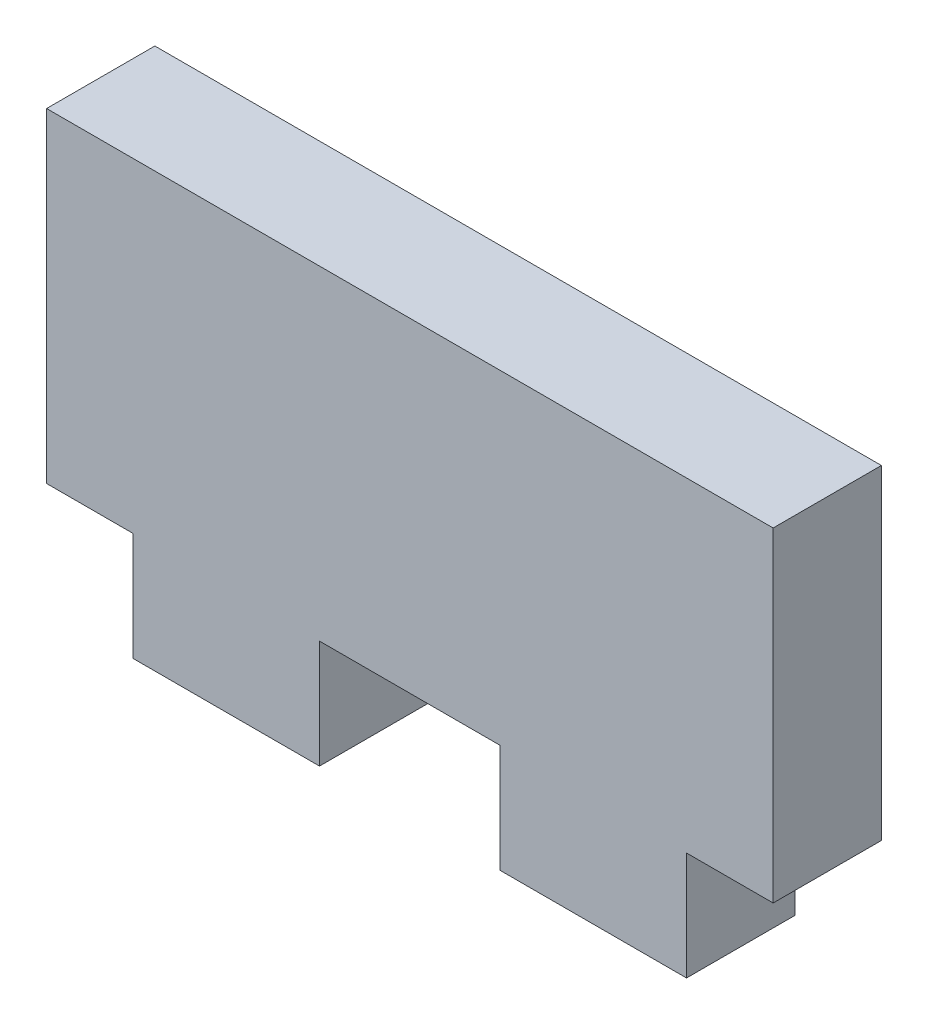
ISO-10303-21;
HEADER;
FILE_DESCRIPTION(('STEP AP214'),'2;1');
FILE_NAME('part.step','',(''),(''),'','','');
FILE_SCHEMA(('AUTOMOTIVE_DESIGN { 1 0 10303 214 1 1 1 1 }'));
ENDSEC;
DATA;
#1=APPLICATION_CONTEXT('core data for automotive mechanical design processes');
#2=APPLICATION_PROTOCOL_DEFINITION('international standard','automotive_design',2000,#1);
#3=PRODUCT_CONTEXT('',#1,'mechanical');
#4=PRODUCT('Part','Part','',(#3));
#5=PRODUCT_RELATED_PRODUCT_CATEGORY('part','',(#4));
#6=PRODUCT_DEFINITION_FORMATION('','',#4);
#7=PRODUCT_DEFINITION_CONTEXT('part definition',#1,'design');
#8=PRODUCT_DEFINITION('design','',#6,#7);
#9=PRODUCT_DEFINITION_SHAPE('','',#8);
#10=(LENGTH_UNIT() NAMED_UNIT(*) SI_UNIT(.MILLI.,.METRE.));
#11=(NAMED_UNIT(*) PLANE_ANGLE_UNIT() SI_UNIT($,.RADIAN.));
#12=(NAMED_UNIT(*) SI_UNIT($,.STERADIAN.) SOLID_ANGLE_UNIT());
#13=UNCERTAINTY_MEASURE_WITH_UNIT(LENGTH_MEASURE(1.E-05),#10,'distance_accuracy_value','');
#14=(GEOMETRIC_REPRESENTATION_CONTEXT(3) GLOBAL_UNCERTAINTY_ASSIGNED_CONTEXT((#13)) GLOBAL_UNIT_ASSIGNED_CONTEXT((#10,
#11,#12)) REPRESENTATION_CONTEXT('',''));
#15=CARTESIAN_POINT('',(0.,0.,0.));
#16=DIRECTION('',(0.,0.,1.));
#17=DIRECTION('',(1.,0.,0.));
#18=AXIS2_PLACEMENT_3D('',#15,#16,#17);
#19=CARTESIAN_POINT('',(-14.8362748703196,19.6140860708967,5.));
#20=DIRECTION('',(-1.,0.,0.));
#21=DIRECTION('',(0.,0.,1.));
#22=AXIS2_PLACEMENT_3D('',#19,#20,#21);
#23=PLANE('',#22);
#24=DIRECTION('',(0.,1.,0.));
#25=VECTOR('',#24,1.);
#26=CARTESIAN_POINT('',(-14.8362748703196,19.6140860708967,0.));
#27=LINE('',#26,#25);
#28=CARTESIAN_POINT('',(-14.8362748703196,19.6140860708967,0.));
#29=VERTEX_POINT('',#28);
#30=CARTESIAN_POINT('',(-14.8362748703196,24.6140860708967,0.));
#31=VERTEX_POINT('',#30);
#32=EDGE_CURVE('E152',#29,#31,#27,.T.);
#33=ORIENTED_EDGE('',*,*,#32,.T.);
#34=DIRECTION('',(0.,0.,-1.));
#35=VECTOR('',#34,1.);
#36=CARTESIAN_POINT('',(-14.8362748703196,24.6140860708967,5.));
#37=LINE('',#36,#35);
#38=CARTESIAN_POINT('',(-14.8362748703196,24.6140860708967,5.));
#39=VERTEX_POINT('',#38);
#40=EDGE_CURVE('E11',#39,#31,#37,.T.);
#41=ORIENTED_EDGE('',*,*,#40,.F.);
#42=DIRECTION('',(0.,1.,0.));
#43=VECTOR('',#42,1.);
#44=CARTESIAN_POINT('',(-14.8362748703196,19.6140860708967,5.));
#45=LINE('',#44,#43);
#46=CARTESIAN_POINT('',(-14.8362748703196,19.6140860708967,5.));
#47=VERTEX_POINT('',#46);
#48=EDGE_CURVE('E174',#47,#39,#45,.T.);
#49=ORIENTED_EDGE('',*,*,#48,.F.);
#50=DIRECTION('',(0.,0.,-1.));
#51=VECTOR('',#50,1.);
#52=CARTESIAN_POINT('',(-14.8362748703196,19.6140860708967,5.));
#53=LINE('',#52,#51);
#54=EDGE_CURVE('E148',#47,#29,#53,.T.);
#55=ORIENTED_EDGE('',*,*,#54,.T.);
#56=EDGE_LOOP('',(#33,#41,#49,#55));
#57=FACE_BOUND('',#56,.T.);
#58=ADVANCED_FACE('F32',(#57),#23,.F.);
#59=CARTESIAN_POINT('',(-14.8362748703196,24.6140860708967,5.));
#60=DIRECTION('',(0.,1.,0.));
#61=DIRECTION('',(0.,0.,1.));
#62=AXIS2_PLACEMENT_3D('',#59,#60,#61);
#63=PLANE('',#62);
#64=DIRECTION('',(1.,0.,0.));
#65=VECTOR('',#64,1.);
#66=CARTESIAN_POINT('',(-14.8362748703196,24.6140860708967,0.));
#67=LINE('',#66,#65);
#68=CARTESIAN_POINT('',(-10.8362748703196,24.6140860708967,0.));
#69=VERTEX_POINT('',#68);
#70=EDGE_CURVE('E155',#31,#69,#67,.T.);
#71=ORIENTED_EDGE('',*,*,#70,.T.);
#72=DIRECTION('',(0.,0.,-1.));
#73=VECTOR('',#72,1.);
#74=CARTESIAN_POINT('',(-10.8362748703196,24.6140860708967,5.));
#75=LINE('',#74,#73);
#76=CARTESIAN_POINT('',(-10.8362748703196,24.6140860708967,5.));
#77=VERTEX_POINT('',#76);
#78=EDGE_CURVE('E40',#77,#69,#75,.T.);
#79=ORIENTED_EDGE('',*,*,#78,.F.);
#80=DIRECTION('',(1.,0.,0.));
#81=VECTOR('',#80,1.);
#82=CARTESIAN_POINT('',(-14.8362748703196,24.6140860708967,5.));
#83=LINE('',#82,#81);
#84=EDGE_CURVE('E103',#39,#77,#83,.T.);
#85=ORIENTED_EDGE('',*,*,#84,.F.);
#86=ORIENTED_EDGE('',*,*,#40,.T.);
#87=EDGE_LOOP('',(#71,#79,#85,#86));
#88=FACE_BOUND('',#87,.T.);
#89=ADVANCED_FACE('F252',(#88),#63,.F.);
#90=CARTESIAN_POINT('',(-10.8362748703196,24.6140860708967,5.));
#91=DIRECTION('',(-1.,0.,0.));
#92=DIRECTION('',(0.,-1.,0.));
#93=AXIS2_PLACEMENT_3D('',#90,#91,#92);
#94=PLANE('',#93);
#95=DIRECTION('',(0.,1.,0.));
#96=VECTOR('',#95,1.);
#97=CARTESIAN_POINT('',(-10.8362748703196,24.6140860708967,0.));
#98=LINE('',#97,#96);
#99=CARTESIAN_POINT('',(-10.8362748703196,39.6140860708967,0.));
#100=VERTEX_POINT('',#99);
#101=EDGE_CURVE('E157',#69,#100,#98,.T.);
#102=ORIENTED_EDGE('',*,*,#101,.T.);
#103=DIRECTION('',(0.,0.,-1.));
#104=VECTOR('',#103,1.);
#105=CARTESIAN_POINT('',(-10.8362748703196,39.6140860708967,5.));
#106=LINE('',#105,#104);
#107=CARTESIAN_POINT('',(-10.8362748703196,39.6140860708967,5.));
#108=VERTEX_POINT('',#107);
#109=EDGE_CURVE('E193',#108,#100,#106,.T.);
#110=ORIENTED_EDGE('',*,*,#109,.F.);
#111=DIRECTION('',(0.,1.,0.));
#112=VECTOR('',#111,1.);
#113=CARTESIAN_POINT('',(-10.8362748703196,24.6140860708967,5.));
#114=LINE('',#113,#112);
#115=EDGE_CURVE('E201',#77,#108,#114,.T.);
#116=ORIENTED_EDGE('',*,*,#115,.F.);
#117=ORIENTED_EDGE('',*,*,#78,.T.);
#118=EDGE_LOOP('',(#102,#110,#116,#117));
#119=FACE_BOUND('',#118,.T.);
#120=ADVANCED_FACE('F199',(#119),#94,.F.);
#121=CARTESIAN_POINT('',(-44.3914748703196,39.6140860708967,5.));
#122=DIRECTION('',(0.,-1.,0.));
#123=DIRECTION('',(0.,0.,-1.));
#124=AXIS2_PLACEMENT_3D('',#121,#122,#123);
#125=PLANE('',#124);
#126=DIRECTION('',(-1.,0.,0.));
#127=VECTOR('',#126,1.);
#128=CARTESIAN_POINT('',(-44.3914748703196,39.6140860708967,0.));
#129=LINE('',#128,#127);
#130=CARTESIAN_POINT('',(-44.3914748703196,39.6140860708967,0.));
#131=VERTEX_POINT('',#130);
#132=EDGE_CURVE('E159',#100,#131,#129,.T.);
#133=ORIENTED_EDGE('',*,*,#132,.T.);
#134=DIRECTION('',(0.,0.,-1.));
#135=VECTOR('',#134,1.);
#136=CARTESIAN_POINT('',(-44.3914748703196,39.6140860708967,5.));
#137=LINE('',#136,#135);
#138=CARTESIAN_POINT('',(-44.3914748703196,39.6140860708967,5.));
#139=VERTEX_POINT('',#138);
#140=EDGE_CURVE('E190',#139,#131,#137,.T.);
#141=ORIENTED_EDGE('',*,*,#140,.F.);
#142=DIRECTION('',(-1.,0.,0.));
#143=VECTOR('',#142,1.);
#144=CARTESIAN_POINT('',(-44.3914748703196,39.6140860708967,5.));
#145=LINE('',#144,#143);
#146=EDGE_CURVE('E219',#108,#139,#145,.T.);
#147=ORIENTED_EDGE('',*,*,#146,.F.);
#148=ORIENTED_EDGE('',*,*,#109,.T.);
#149=EDGE_LOOP('',(#133,#141,#147,#148));
#150=FACE_BOUND('',#149,.T.);
#151=ADVANCED_FACE('F210',(#150),#125,.F.);
#152=CARTESIAN_POINT('',(-44.3914748703196,24.6140860708967,5.));
#153=DIRECTION('',(1.,0.,0.));
#154=DIRECTION('',(0.,0.,-1.));
#155=AXIS2_PLACEMENT_3D('',#152,#153,#154);
#156=PLANE('',#155);
#157=DIRECTION('',(0.,-1.,0.));
#158=VECTOR('',#157,1.);
#159=CARTESIAN_POINT('',(-44.3914748703196,24.6140860708967,0.));
#160=LINE('',#159,#158);
#161=CARTESIAN_POINT('',(-44.3914748703196,24.6140860708967,0.));
#162=VERTEX_POINT('',#161);
#163=EDGE_CURVE('E161',#131,#162,#160,.T.);
#164=ORIENTED_EDGE('',*,*,#163,.T.);
#165=DIRECTION('',(0.,0.,-1.));
#166=VECTOR('',#165,1.);
#167=CARTESIAN_POINT('',(-44.3914748703196,24.6140860708967,5.));
#168=LINE('',#167,#166);
#169=CARTESIAN_POINT('',(-44.3914748703196,24.6140860708967,5.));
#170=VERTEX_POINT('',#169);
#171=EDGE_CURVE('E187',#170,#162,#168,.T.);
#172=ORIENTED_EDGE('',*,*,#171,.F.);
#173=DIRECTION('',(0.,-1.,0.));
#174=VECTOR('',#173,1.);
#175=CARTESIAN_POINT('',(-44.3914748703196,24.6140860708967,5.));
#176=LINE('',#175,#174);
#177=EDGE_CURVE('E216',#139,#170,#176,.T.);
#178=ORIENTED_EDGE('',*,*,#177,.F.);
#179=ORIENTED_EDGE('',*,*,#140,.T.);
#180=EDGE_LOOP('',(#164,#172,#178,#179));
#181=FACE_BOUND('',#180,.T.);
#182=ADVANCED_FACE('F214',(#181),#156,.F.);
#183=CARTESIAN_POINT('',(-40.3914748703196,24.6140860708967,5.));
#184=DIRECTION('',(0.,1.,0.));
#185=DIRECTION('',(0.,0.,1.));
#186=AXIS2_PLACEMENT_3D('',#183,#184,#185);
#187=PLANE('',#186);
#188=DIRECTION('',(1.,0.,0.));
#189=VECTOR('',#188,1.);
#190=CARTESIAN_POINT('',(-40.3914748703196,24.6140860708967,0.));
#191=LINE('',#190,#189);
#192=CARTESIAN_POINT('',(-40.3914748703196,24.6140860708967,0.));
#193=VERTEX_POINT('',#192);
#194=EDGE_CURVE('E163',#162,#193,#191,.T.);
#195=ORIENTED_EDGE('',*,*,#194,.T.);
#196=DIRECTION('',(0.,0.,-1.));
#197=VECTOR('',#196,1.);
#198=CARTESIAN_POINT('',(-40.3914748703196,24.6140860708967,5.));
#199=LINE('',#198,#197);
#200=CARTESIAN_POINT('',(-40.3914748703196,24.6140860708967,5.));
#201=VERTEX_POINT('',#200);
#202=EDGE_CURVE('E184',#201,#193,#199,.T.);
#203=ORIENTED_EDGE('',*,*,#202,.F.);
#204=DIRECTION('',(1.,0.,0.));
#205=VECTOR('',#204,1.);
#206=CARTESIAN_POINT('',(-40.3914748703196,24.6140860708967,5.));
#207=LINE('',#206,#205);
#208=EDGE_CURVE('E218',#170,#201,#207,.T.);
#209=ORIENTED_EDGE('',*,*,#208,.F.);
#210=ORIENTED_EDGE('',*,*,#171,.T.);
#211=EDGE_LOOP('',(#195,#203,#209,#210));
#212=FACE_BOUND('',#211,.T.);
#213=ADVANCED_FACE('F265',(#212),#187,.F.);
#214=CARTESIAN_POINT('',(-40.3914748703196,19.6140860708967,5.));
#215=DIRECTION('',(1.,0.,0.));
#216=DIRECTION('',(0.,0.,-1.));
#217=AXIS2_PLACEMENT_3D('',#214,#215,#216);
#218=PLANE('',#217);
#219=DIRECTION('',(0.,-1.,0.));
#220=VECTOR('',#219,1.);
#221=CARTESIAN_POINT('',(-40.3914748703196,19.6140860708967,0.));
#222=LINE('',#221,#220);
#223=CARTESIAN_POINT('',(-40.3914748703196,19.6140860708967,0.));
#224=VERTEX_POINT('',#223);
#225=EDGE_CURVE('E165',#193,#224,#222,.T.);
#226=ORIENTED_EDGE('',*,*,#225,.T.);
#227=DIRECTION('',(0.,0.,-1.));
#228=VECTOR('',#227,1.);
#229=CARTESIAN_POINT('',(-40.3914748703196,19.6140860708967,5.));
#230=LINE('',#229,#228);
#231=CARTESIAN_POINT('',(-40.3914748703196,19.6140860708967,5.));
#232=VERTEX_POINT('',#231);
#233=EDGE_CURVE('E181',#232,#224,#230,.T.);
#234=ORIENTED_EDGE('',*,*,#233,.F.);
#235=DIRECTION('',(0.,-1.,0.));
#236=VECTOR('',#235,1.);
#237=CARTESIAN_POINT('',(-40.3914748703196,19.6140860708967,5.));
#238=LINE('',#237,#236);
#239=EDGE_CURVE('E221',#201,#232,#238,.T.);
#240=ORIENTED_EDGE('',*,*,#239,.F.);
#241=ORIENTED_EDGE('',*,*,#202,.T.);
#242=EDGE_LOOP('',(#226,#234,#240,#241));
#243=FACE_BOUND('',#242,.T.);
#244=ADVANCED_FACE('F268',(#243),#218,.F.);
#245=CARTESIAN_POINT('',(-31.7871748703196,19.6140860708967,5.));
#246=DIRECTION('',(0.,1.,0.));
#247=DIRECTION('',(0.,0.,1.));
#248=AXIS2_PLACEMENT_3D('',#245,#246,#247);
#249=PLANE('',#248);
#250=DIRECTION('',(1.,0.,0.));
#251=VECTOR('',#250,1.);
#252=CARTESIAN_POINT('',(-31.7871748703196,19.6140860708967,0.));
#253=LINE('',#252,#251);
#254=CARTESIAN_POINT('',(-31.7871748703196,19.6140860708967,0.));
#255=VERTEX_POINT('',#254);
#256=EDGE_CURVE('E167',#224,#255,#253,.T.);
#257=ORIENTED_EDGE('',*,*,#256,.T.);
#258=DIRECTION('',(0.,0.,-1.));
#259=VECTOR('',#258,1.);
#260=CARTESIAN_POINT('',(-31.7871748703196,19.6140860708967,5.));
#261=LINE('',#260,#259);
#262=CARTESIAN_POINT('',(-31.7871748703196,19.6140860708967,5.));
#263=VERTEX_POINT('',#262);
#264=EDGE_CURVE('E178',#263,#255,#261,.T.);
#265=ORIENTED_EDGE('',*,*,#264,.F.);
#266=DIRECTION('',(1.,0.,0.));
#267=VECTOR('',#266,1.);
#268=CARTESIAN_POINT('',(-31.7871748703196,19.6140860708967,5.));
#269=LINE('',#268,#267);
#270=EDGE_CURVE('E227',#232,#263,#269,.T.);
#271=ORIENTED_EDGE('',*,*,#270,.F.);
#272=ORIENTED_EDGE('',*,*,#233,.T.);
#273=EDGE_LOOP('',(#257,#265,#271,#272));
#274=FACE_BOUND('',#273,.T.);
#275=ADVANCED_FACE('F233',(#274),#249,.F.);
#276=CARTESIAN_POINT('',(-31.7871748703196,19.6140860708967,5.));
#277=DIRECTION('',(-1.,0.,0.));
#278=DIRECTION('',(0.,0.,1.));
#279=AXIS2_PLACEMENT_3D('',#276,#277,#278);
#280=PLANE('',#279);
#281=DIRECTION('',(0.,1.,0.));
#282=VECTOR('',#281,1.);
#283=CARTESIAN_POINT('',(-31.7871748703196,19.6140860708967,0.));
#284=LINE('',#283,#282);
#285=CARTESIAN_POINT('',(-31.7871748703196,24.6140860708967,0.));
#286=VERTEX_POINT('',#285);
#287=EDGE_CURVE('E169',#255,#286,#284,.T.);
#288=ORIENTED_EDGE('',*,*,#287,.T.);
#289=DIRECTION('',(0.,0.,-1.));
#290=VECTOR('',#289,1.);
#291=CARTESIAN_POINT('',(-31.7871748703196,24.6140860708967,5.));
#292=LINE('',#291,#290);
#293=CARTESIAN_POINT('',(-31.7871748703196,24.6140860708967,5.));
#294=VERTEX_POINT('',#293);
#295=EDGE_CURVE('E143',#294,#286,#292,.T.);
#296=ORIENTED_EDGE('',*,*,#295,.F.);
#297=DIRECTION('',(0.,1.,0.));
#298=VECTOR('',#297,1.);
#299=CARTESIAN_POINT('',(-31.7871748703196,19.6140860708967,5.));
#300=LINE('',#299,#298);
#301=EDGE_CURVE('E134',#263,#294,#300,.T.);
#302=ORIENTED_EDGE('',*,*,#301,.F.);
#303=ORIENTED_EDGE('',*,*,#264,.T.);
#304=EDGE_LOOP('',(#288,#296,#302,#303));
#305=FACE_BOUND('',#304,.T.);
#306=ADVANCED_FACE('F237',(#305),#280,.F.);
#307=CARTESIAN_POINT('',(-23.4404748703196,24.6140860708967,5.));
#308=DIRECTION('',(0.,1.,0.));
#309=DIRECTION('',(0.,0.,1.));
#310=AXIS2_PLACEMENT_3D('',#307,#308,#309);
#311=PLANE('',#310);
#312=DIRECTION('',(1.,0.,0.));
#313=VECTOR('',#312,1.);
#314=CARTESIAN_POINT('',(-23.4404748703196,24.6140860708967,0.));
#315=LINE('',#314,#313);
#316=CARTESIAN_POINT('',(-23.4404748703196,24.6140860708967,0.));
#317=VERTEX_POINT('',#316);
#318=EDGE_CURVE('E142',#286,#317,#315,.T.);
#319=ORIENTED_EDGE('',*,*,#318,.T.);
#320=DIRECTION('',(0.,0.,-1.));
#321=VECTOR('',#320,1.);
#322=CARTESIAN_POINT('',(-23.4404748703196,24.6140860708967,5.));
#323=LINE('',#322,#321);
#324=CARTESIAN_POINT('',(-23.4404748703196,24.6140860708967,5.));
#325=VERTEX_POINT('',#324);
#326=EDGE_CURVE('E139',#325,#317,#323,.T.);
#327=ORIENTED_EDGE('',*,*,#326,.F.);
#328=DIRECTION('',(1.,0.,0.));
#329=VECTOR('',#328,1.);
#330=CARTESIAN_POINT('',(-23.4404748703196,24.6140860708967,5.));
#331=LINE('',#330,#329);
#332=EDGE_CURVE('E128',#294,#325,#331,.T.);
#333=ORIENTED_EDGE('',*,*,#332,.F.);
#334=ORIENTED_EDGE('',*,*,#295,.T.);
#335=EDGE_LOOP('',(#319,#327,#333,#334));
#336=FACE_BOUND('',#335,.T.);
#337=ADVANCED_FACE('F140',(#336),#311,.F.);
#338=CARTESIAN_POINT('',(-23.4404748703196,19.6140860708967,5.));
#339=DIRECTION('',(1.,0.,0.));
#340=DIRECTION('',(0.,0.,-1.));
#341=AXIS2_PLACEMENT_3D('',#338,#339,#340);
#342=PLANE('',#341);
#343=DIRECTION('',(0.,-1.,0.));
#344=VECTOR('',#343,1.);
#345=CARTESIAN_POINT('',(-23.4404748703196,19.6140860708967,0.));
#346=LINE('',#345,#344);
#347=CARTESIAN_POINT('',(-23.4404748703196,19.6140860708967,0.));
#348=VERTEX_POINT('',#347);
#349=EDGE_CURVE('E89',#317,#348,#346,.T.);
#350=ORIENTED_EDGE('',*,*,#349,.T.);
#351=DIRECTION('',(0.,0.,-1.));
#352=VECTOR('',#351,1.);
#353=CARTESIAN_POINT('',(-23.4404748703196,19.6140860708967,5.));
#354=LINE('',#353,#352);
#355=CARTESIAN_POINT('',(-23.4404748703196,19.6140860708967,5.));
#356=VERTEX_POINT('',#355);
#357=EDGE_CURVE('E144',#356,#348,#354,.T.);
#358=ORIENTED_EDGE('',*,*,#357,.F.);
#359=DIRECTION('',(0.,-1.,0.));
#360=VECTOR('',#359,1.);
#361=CARTESIAN_POINT('',(-23.4404748703196,19.6140860708967,5.));
#362=LINE('',#361,#360);
#363=EDGE_CURVE('E132',#325,#356,#362,.T.);
#364=ORIENTED_EDGE('',*,*,#363,.F.);
#365=ORIENTED_EDGE('',*,*,#326,.T.);
#366=EDGE_LOOP('',(#350,#358,#364,#365));
#367=FACE_BOUND('',#366,.T.);
#368=ADVANCED_FACE('F146',(#367),#342,.F.);
#369=CARTESIAN_POINT('',(-14.8362748703196,19.6140860708967,5.));
#370=DIRECTION('',(0.,1.,0.));
#371=DIRECTION('',(0.,0.,1.));
#372=AXIS2_PLACEMENT_3D('',#369,#370,#371);
#373=PLANE('',#372);
#374=DIRECTION('',(1.,0.,0.));
#375=VECTOR('',#374,1.);
#376=CARTESIAN_POINT('',(-14.8362748703196,19.6140860708967,0.));
#377=LINE('',#376,#375);
#378=EDGE_CURVE('E95',#348,#29,#377,.T.);
#379=ORIENTED_EDGE('',*,*,#378,.T.);
#380=ORIENTED_EDGE('',*,*,#54,.F.);
#381=DIRECTION('',(1.,0.,0.));
#382=VECTOR('',#381,1.);
#383=CARTESIAN_POINT('',(-14.8362748703196,19.6140860708967,5.));
#384=LINE('',#383,#382);
#385=EDGE_CURVE('E48',#356,#47,#384,.T.);
#386=ORIENTED_EDGE('',*,*,#385,.F.);
#387=ORIENTED_EDGE('',*,*,#357,.T.);
#388=EDGE_LOOP('',(#379,#380,#386,#387));
#389=FACE_BOUND('',#388,.T.);
#390=ADVANCED_FACE('F241',(#389),#373,.F.);
#391=CARTESIAN_POINT('',(0.,0.,5.));
#392=DIRECTION('',(0.,0.,-1.));
#393=DIRECTION('',(-1.,0.,0.));
#394=AXIS2_PLACEMENT_3D('',#391,#392,#393);
#395=PLANE('',#394);
#396=ORIENTED_EDGE('',*,*,#48,.T.);
#397=ORIENTED_EDGE('',*,*,#84,.T.);
#398=ORIENTED_EDGE('',*,*,#115,.T.);
#399=ORIENTED_EDGE('',*,*,#146,.T.);
#400=ORIENTED_EDGE('',*,*,#177,.T.);
#401=ORIENTED_EDGE('',*,*,#208,.T.);
#402=ORIENTED_EDGE('',*,*,#239,.T.);
#403=ORIENTED_EDGE('',*,*,#270,.T.);
#404=ORIENTED_EDGE('',*,*,#301,.T.);
#405=ORIENTED_EDGE('',*,*,#332,.T.);
#406=ORIENTED_EDGE('',*,*,#363,.T.);
#407=ORIENTED_EDGE('',*,*,#385,.T.);
#408=EDGE_LOOP('',(#396,#397,#398,#399,#400,#401,#402,#403,#404,#405,#406,#407));
#409=FACE_BOUND('',#408,.T.);
#410=ADVANCED_FACE('F130',(#409),#395,.F.);
#411=CARTESIAN_POINT('',(0.,0.,0.));
#412=DIRECTION('',(0.,0.,-1.));
#413=DIRECTION('',(-1.,0.,0.));
#414=AXIS2_PLACEMENT_3D('',#411,#412,#413);
#415=PLANE('',#414);
#416=ORIENTED_EDGE('',*,*,#32,.F.);
#417=ORIENTED_EDGE('',*,*,#378,.F.);
#418=ORIENTED_EDGE('',*,*,#349,.F.);
#419=ORIENTED_EDGE('',*,*,#318,.F.);
#420=ORIENTED_EDGE('',*,*,#287,.F.);
#421=ORIENTED_EDGE('',*,*,#256,.F.);
#422=ORIENTED_EDGE('',*,*,#225,.F.);
#423=ORIENTED_EDGE('',*,*,#194,.F.);
#424=ORIENTED_EDGE('',*,*,#163,.F.);
#425=ORIENTED_EDGE('',*,*,#132,.F.);
#426=ORIENTED_EDGE('',*,*,#101,.F.);
#427=ORIENTED_EDGE('',*,*,#70,.F.);
#428=EDGE_LOOP('',(#416,#417,#418,#419,#420,#421,#422,#423,#424,#425,#426,#427));
#429=FACE_BOUND('',#428,.T.);
#430=ADVANCED_FACE('F205',(#429),#415,.T.);
#431=CLOSED_SHELL('',(#58,#89,#120,#151,#182,#213,#244,#275,#306,#337,#368,#390,#410,#430));
#432=MANIFOLD_SOLID_BREP('B2',#431);
#433=ADVANCED_BREP_SHAPE_REPRESENTATION('',(#18,#432),#14);
#434=SHAPE_DEFINITION_REPRESENTATION(#9,#433);
ENDSEC;
END-ISO-10303-21;
